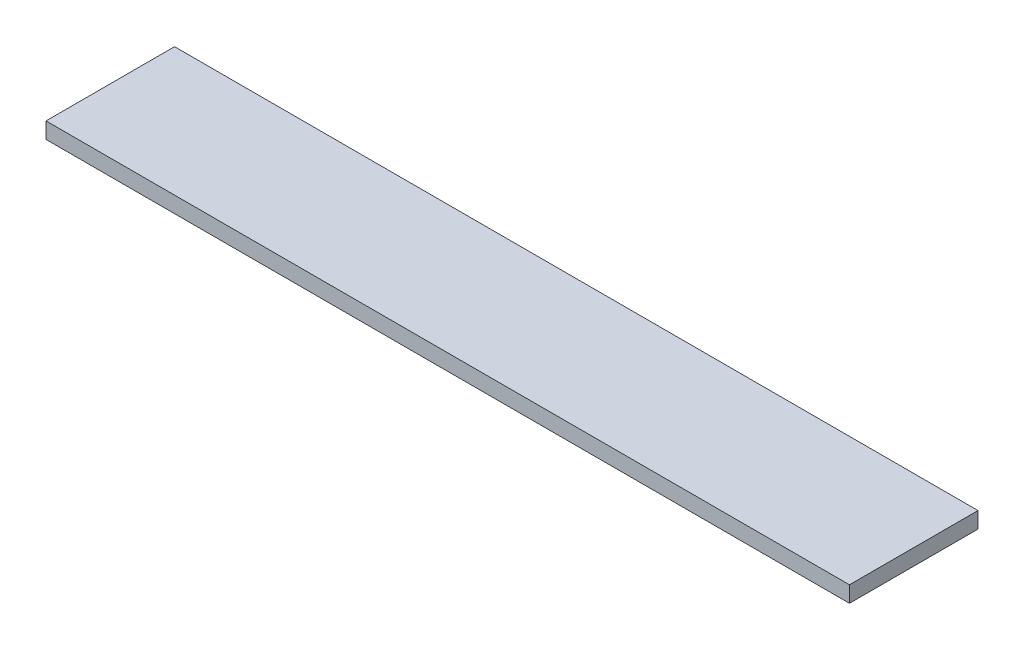
ISO-10303-21;
HEADER;
FILE_DESCRIPTION(('STEP AP214'),'2;1');
FILE_NAME('part.step','',(''),(''),'','','');
FILE_SCHEMA(('AUTOMOTIVE_DESIGN { 1 0 10303 214 1 1 1 1 }'));
ENDSEC;
DATA;
#1=APPLICATION_CONTEXT('core data for automotive mechanical design processes');
#2=APPLICATION_PROTOCOL_DEFINITION('international standard','automotive_design',2000,#1);
#3=PRODUCT_CONTEXT('',#1,'mechanical');
#4=PRODUCT('Part','Part','',(#3));
#5=PRODUCT_RELATED_PRODUCT_CATEGORY('part','',(#4));
#6=PRODUCT_DEFINITION_FORMATION('','',#4);
#7=PRODUCT_DEFINITION_CONTEXT('part definition',#1,'design');
#8=PRODUCT_DEFINITION('design','',#6,#7);
#9=PRODUCT_DEFINITION_SHAPE('','',#8);
#10=(LENGTH_UNIT() NAMED_UNIT(*) SI_UNIT(.MILLI.,.METRE.));
#11=(NAMED_UNIT(*) PLANE_ANGLE_UNIT() SI_UNIT($,.RADIAN.));
#12=(NAMED_UNIT(*) SI_UNIT($,.STERADIAN.) SOLID_ANGLE_UNIT());
#13=UNCERTAINTY_MEASURE_WITH_UNIT(LENGTH_MEASURE(1.E-05),#10,'distance_accuracy_value','');
#14=(GEOMETRIC_REPRESENTATION_CONTEXT(3) GLOBAL_UNCERTAINTY_ASSIGNED_CONTEXT((#13)) GLOBAL_UNIT_ASSIGNED_CONTEXT((#10,
#11,#12)) REPRESENTATION_CONTEXT('',''));
#15=CARTESIAN_POINT('',(0.,0.,0.));
#16=DIRECTION('',(0.,0.,1.));
#17=DIRECTION('',(1.,0.,0.));
#18=AXIS2_PLACEMENT_3D('',#15,#16,#17);
#19=CARTESIAN_POINT('',(317.5,12.7,50.8));
#20=DIRECTION('',(-1.,0.,0.));
#21=DIRECTION('',(0.,0.,1.));
#22=AXIS2_PLACEMENT_3D('',#19,#20,#21);
#23=PLANE('',#22);
#24=DIRECTION('',(0.,0.,-1.));
#25=VECTOR('',#24,1.);
#26=CARTESIAN_POINT('',(317.5,0.,50.8));
#27=LINE('',#26,#25);
#28=CARTESIAN_POINT('',(317.5,0.,50.8));
#29=VERTEX_POINT('',#28);
#30=CARTESIAN_POINT('',(317.5,0.,-50.8));
#31=VERTEX_POINT('',#30);
#32=EDGE_CURVE('E96',#29,#31,#27,.T.);
#33=ORIENTED_EDGE('',*,*,#32,.T.);
#34=DIRECTION('',(0.,-1.,0.));
#35=VECTOR('',#34,1.);
#36=CARTESIAN_POINT('',(317.5,12.7,-50.8));
#37=LINE('',#36,#35);
#38=CARTESIAN_POINT('',(317.5,12.7,-50.8));
#39=VERTEX_POINT('',#38);
#40=EDGE_CURVE('E11',#39,#31,#37,.T.);
#41=ORIENTED_EDGE('',*,*,#40,.F.);
#42=DIRECTION('',(0.,0.,-1.));
#43=VECTOR('',#42,1.);
#44=CARTESIAN_POINT('',(317.5,12.7,50.8));
#45=LINE('',#44,#43);
#46=CARTESIAN_POINT('',(317.5,12.7,50.8));
#47=VERTEX_POINT('',#46);
#48=EDGE_CURVE('E84',#47,#39,#45,.T.);
#49=ORIENTED_EDGE('',*,*,#48,.F.);
#50=DIRECTION('',(0.,-1.,0.));
#51=VECTOR('',#50,1.);
#52=CARTESIAN_POINT('',(317.5,12.7,50.8));
#53=LINE('',#52,#51);
#54=EDGE_CURVE('E92',#47,#29,#53,.T.);
#55=ORIENTED_EDGE('',*,*,#54,.T.);
#56=EDGE_LOOP('',(#33,#41,#49,#55));
#57=FACE_BOUND('',#56,.T.);
#58=ADVANCED_FACE('F33',(#57),#23,.F.);
#59=CARTESIAN_POINT('',(-317.5,12.7,-50.8));
#60=DIRECTION('',(0.,0.,1.));
#61=DIRECTION('',(1.,0.,0.));
#62=AXIS2_PLACEMENT_3D('',#59,#60,#61);
#63=PLANE('',#62);
#64=DIRECTION('',(-1.,0.,0.));
#65=VECTOR('',#64,1.);
#66=CARTESIAN_POINT('',(-317.5,0.,-50.8));
#67=LINE('',#66,#65);
#68=CARTESIAN_POINT('',(-317.5,0.,-50.8));
#69=VERTEX_POINT('',#68);
#70=EDGE_CURVE('E88',#31,#69,#67,.T.);
#71=ORIENTED_EDGE('',*,*,#70,.T.);
#72=DIRECTION('',(0.,-1.,0.));
#73=VECTOR('',#72,1.);
#74=CARTESIAN_POINT('',(-317.5,12.7,-50.8));
#75=LINE('',#74,#73);
#76=CARTESIAN_POINT('',(-317.5,12.7,-50.8));
#77=VERTEX_POINT('',#76);
#78=EDGE_CURVE('E41',#77,#69,#75,.T.);
#79=ORIENTED_EDGE('',*,*,#78,.F.);
#80=DIRECTION('',(-1.,0.,0.));
#81=VECTOR('',#80,1.);
#82=CARTESIAN_POINT('',(-317.5,12.7,-50.8));
#83=LINE('',#82,#81);
#84=EDGE_CURVE('E79',#39,#77,#83,.T.);
#85=ORIENTED_EDGE('',*,*,#84,.F.);
#86=ORIENTED_EDGE('',*,*,#40,.T.);
#87=EDGE_LOOP('',(#71,#79,#85,#86));
#88=FACE_BOUND('',#87,.T.);
#89=ADVANCED_FACE('F87',(#88),#63,.F.);
#90=CARTESIAN_POINT('',(-317.5,12.7,50.8));
#91=DIRECTION('',(1.,0.,0.));
#92=DIRECTION('',(0.,0.,-1.));
#93=AXIS2_PLACEMENT_3D('',#90,#91,#92);
#94=PLANE('',#93);
#95=DIRECTION('',(0.,0.,1.));
#96=VECTOR('',#95,1.);
#97=CARTESIAN_POINT('',(-317.5,0.,50.8));
#98=LINE('',#97,#96);
#99=CARTESIAN_POINT('',(-317.5,0.,50.8));
#100=VERTEX_POINT('',#99);
#101=EDGE_CURVE('E66',#69,#100,#98,.T.);
#102=ORIENTED_EDGE('',*,*,#101,.T.);
#103=DIRECTION('',(0.,-1.,0.));
#104=VECTOR('',#103,1.);
#105=CARTESIAN_POINT('',(-317.5,12.7,50.8));
#106=LINE('',#105,#104);
#107=CARTESIAN_POINT('',(-317.5,12.7,50.8));
#108=VERTEX_POINT('',#107);
#109=EDGE_CURVE('E89',#108,#100,#106,.T.);
#110=ORIENTED_EDGE('',*,*,#109,.F.);
#111=DIRECTION('',(0.,0.,1.));
#112=VECTOR('',#111,1.);
#113=CARTESIAN_POINT('',(-317.5,12.7,50.8));
#114=LINE('',#113,#112);
#115=EDGE_CURVE('E82',#77,#108,#114,.T.);
#116=ORIENTED_EDGE('',*,*,#115,.F.);
#117=ORIENTED_EDGE('',*,*,#78,.T.);
#118=EDGE_LOOP('',(#102,#110,#116,#117));
#119=FACE_BOUND('',#118,.T.);
#120=ADVANCED_FACE('F90',(#119),#94,.F.);
#121=CARTESIAN_POINT('',(-317.5,12.7,50.8));
#122=DIRECTION('',(0.,0.,-1.));
#123=DIRECTION('',(-1.,0.,0.));
#124=AXIS2_PLACEMENT_3D('',#121,#122,#123);
#125=PLANE('',#124);
#126=DIRECTION('',(1.,0.,0.));
#127=VECTOR('',#126,1.);
#128=CARTESIAN_POINT('',(-317.5,0.,50.8));
#129=LINE('',#128,#127);
#130=EDGE_CURVE('E72',#100,#29,#129,.T.);
#131=ORIENTED_EDGE('',*,*,#130,.T.);
#132=ORIENTED_EDGE('',*,*,#54,.F.);
#133=DIRECTION('',(1.,0.,0.));
#134=VECTOR('',#133,1.);
#135=CARTESIAN_POINT('',(-317.5,12.7,50.8));
#136=LINE('',#135,#134);
#137=EDGE_CURVE('E49',#108,#47,#136,.T.);
#138=ORIENTED_EDGE('',*,*,#137,.F.);
#139=ORIENTED_EDGE('',*,*,#109,.T.);
#140=EDGE_LOOP('',(#131,#132,#138,#139));
#141=FACE_BOUND('',#140,.T.);
#142=ADVANCED_FACE('F103',(#141),#125,.F.);
#143=CARTESIAN_POINT('',(0.,12.7,0.));
#144=DIRECTION('',(0.,-1.,0.));
#145=DIRECTION('',(0.,0.,-1.));
#146=AXIS2_PLACEMENT_3D('',#143,#144,#145);
#147=PLANE('',#146);
#148=ORIENTED_EDGE('',*,*,#48,.T.);
#149=ORIENTED_EDGE('',*,*,#84,.T.);
#150=ORIENTED_EDGE('',*,*,#115,.T.);
#151=ORIENTED_EDGE('',*,*,#137,.T.);
#152=EDGE_LOOP('',(#148,#149,#150,#151));
#153=FACE_BOUND('',#152,.T.);
#154=ADVANCED_FACE('F80',(#153),#147,.F.);
#155=CARTESIAN_POINT('',(0.,0.,0.));
#156=DIRECTION('',(0.,-1.,0.));
#157=DIRECTION('',(0.,0.,-1.));
#158=AXIS2_PLACEMENT_3D('',#155,#156,#157);
#159=PLANE('',#158);
#160=ORIENTED_EDGE('',*,*,#32,.F.);
#161=ORIENTED_EDGE('',*,*,#130,.F.);
#162=ORIENTED_EDGE('',*,*,#101,.F.);
#163=ORIENTED_EDGE('',*,*,#70,.F.);
#164=EDGE_LOOP('',(#160,#161,#162,#163));
#165=FACE_BOUND('',#164,.T.);
#166=ADVANCED_FACE('F106',(#165),#159,.T.);
#167=CLOSED_SHELL('',(#58,#89,#120,#142,#154,#166));
#168=MANIFOLD_SOLID_BREP('B2',#167);
#169=ADVANCED_BREP_SHAPE_REPRESENTATION('',(#18,#168),#14);
#170=SHAPE_DEFINITION_REPRESENTATION(#9,#169);
ENDSEC;
END-ISO-10303-21;
